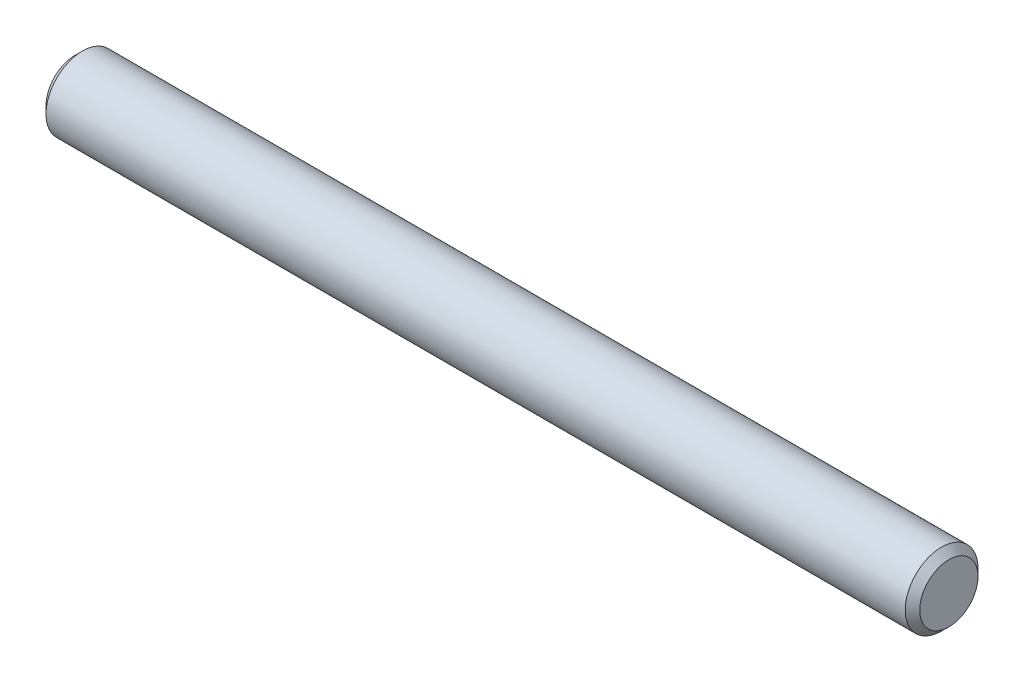
ISO-10303-21;
HEADER;
FILE_DESCRIPTION(('STEP AP214'),'2;1');
FILE_NAME('part.step','',(''),(''),'','','');
FILE_SCHEMA(('AUTOMOTIVE_DESIGN { 1 0 10303 214 1 1 1 1 }'));
ENDSEC;
DATA;
#1=APPLICATION_CONTEXT('core data for automotive mechanical design processes');
#2=APPLICATION_PROTOCOL_DEFINITION('international standard','automotive_design',2000,#1);
#3=PRODUCT_CONTEXT('',#1,'mechanical');
#4=PRODUCT('Part','Part','',(#3));
#5=PRODUCT_RELATED_PRODUCT_CATEGORY('part','',(#4));
#6=PRODUCT_DEFINITION_FORMATION('','',#4);
#7=PRODUCT_DEFINITION_CONTEXT('part definition',#1,'design');
#8=PRODUCT_DEFINITION('design','',#6,#7);
#9=PRODUCT_DEFINITION_SHAPE('','',#8);
#10=(LENGTH_UNIT() NAMED_UNIT(*) SI_UNIT(.MILLI.,.METRE.));
#11=(NAMED_UNIT(*) PLANE_ANGLE_UNIT() SI_UNIT($,.RADIAN.));
#12=(NAMED_UNIT(*) SI_UNIT($,.STERADIAN.) SOLID_ANGLE_UNIT());
#13=UNCERTAINTY_MEASURE_WITH_UNIT(LENGTH_MEASURE(1.E-05),#10,'distance_accuracy_value','');
#14=(GEOMETRIC_REPRESENTATION_CONTEXT(3) GLOBAL_UNCERTAINTY_ASSIGNED_CONTEXT((#13)) GLOBAL_UNIT_ASSIGNED_CONTEXT((#10,
#11,#12)) REPRESENTATION_CONTEXT('',''));
#15=CARTESIAN_POINT('',(0.,0.,0.));
#16=DIRECTION('',(0.,0.,1.));
#17=DIRECTION('',(1.,0.,0.));
#18=AXIS2_PLACEMENT_3D('',#15,#16,#17);
#19=CARTESIAN_POINT('',(-19.05,0.,0.));
#20=DIRECTION('',(1.,0.,0.));
#21=DIRECTION('',(0.,0.,-1.));
#22=AXIS2_PLACEMENT_3D('',#19,#20,#21);
#23=CYLINDRICAL_SURFACE('',#22,1.5875);
#24=CARTESIAN_POINT('',(18.7325,0.,0.));
#25=DIRECTION('',(1.,0.,0.));
#26=DIRECTION('',(0.,0.,-1.));
#27=AXIS2_PLACEMENT_3D('',#24,#25,#26);
#28=CIRCLE('',#27,1.5875);
#29=CARTESIAN_POINT('',(18.7325,0.,-1.5875));
#30=VERTEX_POINT('',#29);
#31=EDGE_CURVE('E37',#30,#30,#28,.F.);
#32=CARTESIAN_POINT('',(-18.7325,0.,0.));
#33=DIRECTION('',(1.,0.,0.));
#34=DIRECTION('',(0.,0.,-1.));
#35=AXIS2_PLACEMENT_3D('',#32,#33,#34);
#36=CIRCLE('',#35,1.5875);
#37=CARTESIAN_POINT('',(-18.7325,0.,-1.5875));
#38=VERTEX_POINT('',#37);
#39=EDGE_CURVE('E41',#38,#38,#36,.T.);
#40=CARTESIAN_POINT('',(18.7325,0.,-1.5875));
#41=CARTESIAN_POINT('',(18.3422395833333,0.,-1.5875));
#42=CARTESIAN_POINT('',(17.9519791666667,0.,-1.5875));
#43=CARTESIAN_POINT('',(17.1714583333333,0.,-1.5875));
#44=CARTESIAN_POINT('',(16.7811979166667,0.,-1.5875));
#45=CARTESIAN_POINT('',(16.0006770833333,0.,-1.5875));
#46=CARTESIAN_POINT('',(15.6104166666667,0.,-1.5875));
#47=CARTESIAN_POINT('',(14.8298958333333,0.,-1.5875));
#48=CARTESIAN_POINT('',(14.4396354166667,0.,-1.5875));
#49=CARTESIAN_POINT('',(13.6591145833333,0.,-1.5875));
#50=CARTESIAN_POINT('',(13.2688541666667,0.,-1.5875));
#51=CARTESIAN_POINT('',(12.4883333333333,0.,-1.5875));
#52=CARTESIAN_POINT('',(12.0980729166667,0.,-1.5875));
#53=CARTESIAN_POINT('',(11.3175520833333,0.,-1.5875));
#54=CARTESIAN_POINT('',(10.9272916666667,0.,-1.5875));
#55=CARTESIAN_POINT('',(10.1467708333333,0.,-1.5875));
#56=CARTESIAN_POINT('',(9.75651041666668,0.,-1.5875));
#57=CARTESIAN_POINT('',(8.97598958333334,0.,-1.5875));
#58=CARTESIAN_POINT('',(8.58572916666668,0.,-1.5875));
#59=CARTESIAN_POINT('',(7.80520833333334,0.,-1.5875));
#60=CARTESIAN_POINT('',(7.41494791666668,0.,-1.5875));
#61=CARTESIAN_POINT('',(6.63442708333335,0.,-1.5875));
#62=CARTESIAN_POINT('',(6.24416666666668,0.,-1.5875));
#63=CARTESIAN_POINT('',(5.46364583333335,0.,-1.5875));
#64=CARTESIAN_POINT('',(5.07338541666668,0.,-1.5875));
#65=CARTESIAN_POINT('',(4.29286458333334,0.,-1.5875));
#66=CARTESIAN_POINT('',(3.90260416666668,0.,-1.5875));
#67=CARTESIAN_POINT('',(3.12208333333335,0.,-1.5875));
#68=CARTESIAN_POINT('',(2.73182291666668,0.,-1.5875));
#69=CARTESIAN_POINT('',(1.95130208333335,0.,-1.5875));
#70=CARTESIAN_POINT('',(1.56104166666668,0.,-1.5875));
#71=CARTESIAN_POINT('',(0.780520833333347,0.,-1.5875));
#72=CARTESIAN_POINT('',(0.39026041666668,0.,-1.5875));
#73=CARTESIAN_POINT('',(-0.390260416666652,0.,-1.5875));
#74=CARTESIAN_POINT('',(-0.780520833333319,0.,-1.5875));
#75=CARTESIAN_POINT('',(-1.56104166666665,0.,-1.5875));
#76=CARTESIAN_POINT('',(-1.95130208333332,0.,-1.5875));
#77=CARTESIAN_POINT('',(-2.73182291666665,0.,-1.5875));
#78=CARTESIAN_POINT('',(-3.12208333333332,0.,-1.5875));
#79=CARTESIAN_POINT('',(-3.90260416666665,0.,-1.5875));
#80=CARTESIAN_POINT('',(-4.29286458333331,0.,-1.5875));
#81=CARTESIAN_POINT('',(-5.07338541666665,0.,-1.5875));
#82=CARTESIAN_POINT('',(-5.46364583333332,0.,-1.5875));
#83=CARTESIAN_POINT('',(-6.24416666666665,0.,-1.5875));
#84=CARTESIAN_POINT('',(-6.63442708333332,0.,-1.5875));
#85=CARTESIAN_POINT('',(-7.41494791666665,0.,-1.5875));
#86=CARTESIAN_POINT('',(-7.80520833333332,0.,-1.5875));
#87=CARTESIAN_POINT('',(-8.58572916666665,0.,-1.5875));
#88=CARTESIAN_POINT('',(-8.97598958333331,0.,-1.5875));
#89=CARTESIAN_POINT('',(-9.75651041666665,0.,-1.5875));
#90=CARTESIAN_POINT('',(-10.1467708333333,0.,-1.5875));
#91=CARTESIAN_POINT('',(-10.9272916666666,0.,-1.5875));
#92=CARTESIAN_POINT('',(-11.3175520833333,0.,-1.5875));
#93=CARTESIAN_POINT('',(-12.0980729166666,0.,-1.5875));
#94=CARTESIAN_POINT('',(-12.4883333333333,0.,-1.5875));
#95=CARTESIAN_POINT('',(-13.2688541666666,0.,-1.5875));
#96=CARTESIAN_POINT('',(-13.6591145833333,0.,-1.5875));
#97=CARTESIAN_POINT('',(-14.4396354166666,0.,-1.5875));
#98=CARTESIAN_POINT('',(-14.8298958333333,0.,-1.5875));
#99=CARTESIAN_POINT('',(-15.6104166666666,0.,-1.5875));
#100=CARTESIAN_POINT('',(-16.0006770833333,0.,-1.5875));
#101=CARTESIAN_POINT('',(-16.7811979166666,0.,-1.5875));
#102=CARTESIAN_POINT('',(-17.1714583333333,0.,-1.5875));
#103=CARTESIAN_POINT('',(-17.9519791666666,0.,-1.5875));
#104=CARTESIAN_POINT('',(-18.3422395833333,0.,-1.5875));
#105=CARTESIAN_POINT('',(-18.7325,0.,-1.5875));
#106=B_SPLINE_CURVE_WITH_KNOTS('',3,(#40,#41,#42,#43,#44,#45,#46,#47,#48,#49,#50,#51,#52,#53,
#54,#55,#56,#57,#58,#59,#60,#61,#62,#63,#64,#65,#66,#67,#68,#69,#70,#71,#72,#73,#74,#75,#76,#77,
#78,#79,#80,#81,#82,#83,#84,#85,#86,#87,#88,#89,#90,#91,#92,#93,#94,#95,#96,#97,#98,#99,#100,
#101,#102,#103,#104,#105),.UNSPECIFIED.,.F.,.F.,(4,2,2,2,2,2,2,2,2,2,2,2,2,2,2,2,2,2,2,2,2,2,2,
2,2,2,2,2,2,2,2,2,4),(0.,1.17078125,2.3415625,3.51234375,4.683125,5.85390625,7.02468749999999,
8.19546874999999,9.36624999999999,10.53703125,11.7078125,12.87859375,14.049375,15.22015625,
16.3909375,17.56171875,18.7325,19.90328125,21.0740625,22.24484375,23.415625,24.58640625,
25.7571875,26.92796875,28.09875,29.26953125,30.4403125,31.61109375,32.781875,33.95265625,
35.1234375,36.29421875,37.465),.UNSPECIFIED.);
#107=EDGE_CURVE('BSEAM30',#30,#38,#106,.T.);
#108=ORIENTED_EDGE('',*,*,#31,.T.);
#109=ORIENTED_EDGE('',*,*,#39,.T.);
#110=ORIENTED_EDGE('',*,*,#107,.T.);
#111=ORIENTED_EDGE('',*,*,#107,.F.);
#112=EDGE_LOOP('',(#108,#110,#109,#111));
#113=FACE_BOUND('',#112,.T.);
#114=ADVANCED_FACE('F30',(#113),#23,.T.);
#115=CARTESIAN_POINT('',(-19.05,0.,0.));
#116=DIRECTION('',(1.,0.,0.));
#117=DIRECTION('',(0.,0.,-1.));
#118=AXIS2_PLACEMENT_3D('',#115,#116,#117);
#119=PLANE('',#118);
#120=CARTESIAN_POINT('',(-19.05,0.,0.));
#121=DIRECTION('',(1.,0.,0.));
#122=DIRECTION('',(0.,0.,-1.));
#123=AXIS2_PLACEMENT_3D('',#120,#121,#122);
#124=CIRCLE('',#123,1.26999999999998);
#125=CARTESIAN_POINT('',(-19.05,0.,-1.26999999999998));
#126=VERTEX_POINT('',#125);
#127=EDGE_CURVE('E10',#126,#126,#124,.F.);
#128=ORIENTED_EDGE('',*,*,#127,.T.);
#129=EDGE_LOOP('',(#128));
#130=FACE_BOUND('',#129,.T.);
#131=ADVANCED_FACE('F61',(#130),#119,.F.);
#132=CARTESIAN_POINT('',(19.05,0.,0.));
#133=DIRECTION('',(1.,0.,0.));
#134=DIRECTION('',(0.,0.,-1.));
#135=AXIS2_PLACEMENT_3D('',#132,#133,#134);
#136=PLANE('',#135);
#137=CARTESIAN_POINT('',(19.05,0.,0.));
#138=DIRECTION('',(1.,0.,0.));
#139=DIRECTION('',(0.,0.,-1.));
#140=AXIS2_PLACEMENT_3D('',#137,#138,#139);
#141=CIRCLE('',#140,1.27);
#142=CARTESIAN_POINT('',(19.05,0.,-1.27));
#143=VERTEX_POINT('',#142);
#144=EDGE_CURVE('E45',#143,#143,#141,.T.);
#145=ORIENTED_EDGE('',*,*,#144,.T.);
#146=EDGE_LOOP('',(#145));
#147=FACE_BOUND('',#146,.T.);
#148=ADVANCED_FACE('F51',(#147),#136,.T.);
#149=CARTESIAN_POINT('',(19.05,0.,0.));
#150=DIRECTION('',(-1.,0.,0.));
#151=DIRECTION('',(0.,0.,1.));
#152=AXIS2_PLACEMENT_3D('',#149,#150,#151);
#153=CONICAL_SURFACE('',#152,1.27,0.785398163397462);
#154=ORIENTED_EDGE('',*,*,#31,.F.);
#155=EDGE_LOOP('',(#154));
#156=FACE_BOUND('',#155,.T.);
#157=ORIENTED_EDGE('',*,*,#144,.F.);
#158=EDGE_LOOP('',(#157));
#159=FACE_BOUND('',#158,.T.);
#160=ADVANCED_FACE('F53',(#156,#159),#153,.T.);
#161=CARTESIAN_POINT('',(-18.7325,0.,0.));
#162=DIRECTION('',(1.,0.,0.));
#163=DIRECTION('',(0.,0.,-1.));
#164=AXIS2_PLACEMENT_3D('',#161,#162,#163);
#165=CONICAL_SURFACE('',#164,1.5875,0.785398163397445);
#166=ORIENTED_EDGE('',*,*,#127,.F.);
#167=EDGE_LOOP('',(#166));
#168=FACE_BOUND('',#167,.T.);
#169=ORIENTED_EDGE('',*,*,#39,.F.);
#170=EDGE_LOOP('',(#169));
#171=FACE_BOUND('',#170,.T.);
#172=ADVANCED_FACE('F32',(#168,#171),#165,.T.);
#173=CLOSED_SHELL('',(#114,#131,#148,#160,#172));
#174=MANIFOLD_SOLID_BREP('B2',#173);
#175=ADVANCED_BREP_SHAPE_REPRESENTATION('',(#18,#174),#14);
#176=SHAPE_DEFINITION_REPRESENTATION(#9,#175);
ENDSEC;
END-ISO-10303-21;
